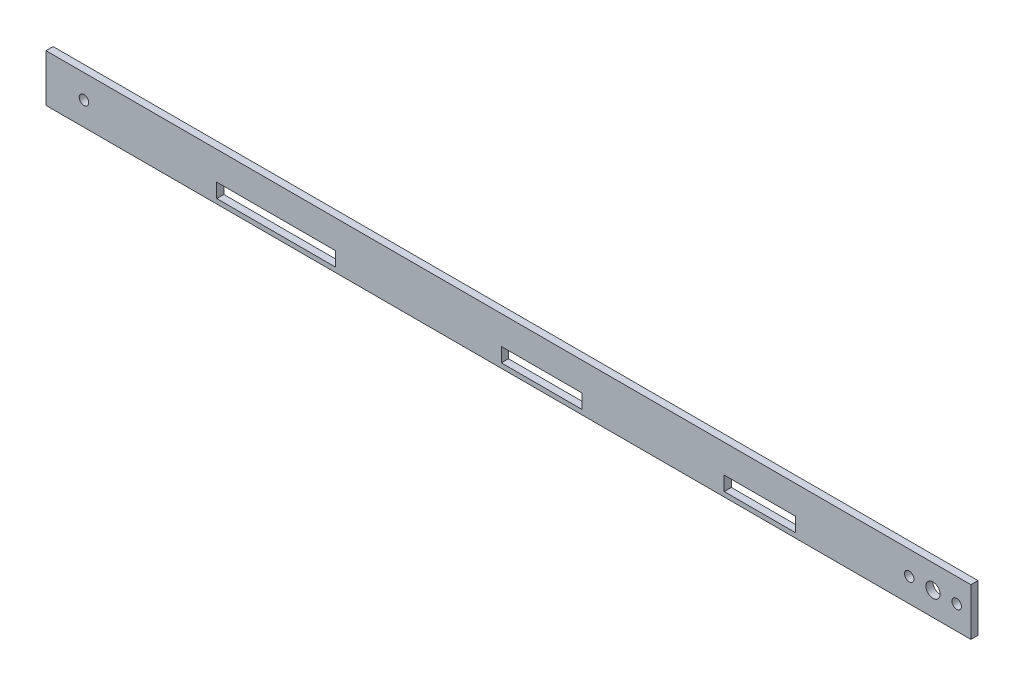
ISO-10303-21;
HEADER;
FILE_DESCRIPTION(('STEP AP214'),'2;1');
FILE_NAME('part.step','',(''),(''),'','','');
FILE_SCHEMA(('AUTOMOTIVE_DESIGN { 1 0 10303 214 1 1 1 1 }'));
ENDSEC;
DATA;
#1=APPLICATION_CONTEXT('core data for automotive mechanical design processes');
#2=APPLICATION_PROTOCOL_DEFINITION('international standard','automotive_design',2000,#1);
#3=PRODUCT_CONTEXT('',#1,'mechanical');
#4=PRODUCT('Part','Part','',(#3));
#5=PRODUCT_RELATED_PRODUCT_CATEGORY('part','',(#4));
#6=PRODUCT_DEFINITION_FORMATION('','',#4);
#7=PRODUCT_DEFINITION_CONTEXT('part definition',#1,'design');
#8=PRODUCT_DEFINITION('design','',#6,#7);
#9=PRODUCT_DEFINITION_SHAPE('','',#8);
#10=(LENGTH_UNIT() NAMED_UNIT(*) SI_UNIT(.MILLI.,.METRE.));
#11=(NAMED_UNIT(*) PLANE_ANGLE_UNIT() SI_UNIT($,.RADIAN.));
#12=(NAMED_UNIT(*) SI_UNIT($,.STERADIAN.) SOLID_ANGLE_UNIT());
#13=UNCERTAINTY_MEASURE_WITH_UNIT(LENGTH_MEASURE(1.E-05),#10,'distance_accuracy_value','');
#14=(GEOMETRIC_REPRESENTATION_CONTEXT(3) GLOBAL_UNCERTAINTY_ASSIGNED_CONTEXT((#13)) GLOBAL_UNIT_ASSIGNED_CONTEXT((#10,
#11,#12)) REPRESENTATION_CONTEXT('',''));
#15=CARTESIAN_POINT('',(0.,0.,0.));
#16=DIRECTION('',(0.,0.,1.));
#17=DIRECTION('',(1.,0.,0.));
#18=AXIS2_PLACEMENT_3D('',#15,#16,#17);
#19=CARTESIAN_POINT('',(0.,0.,1.5));
#20=DIRECTION('',(0.,0.,1.));
#21=DIRECTION('',(1.,0.,0.));
#22=AXIS2_PLACEMENT_3D('',#19,#20,#21);
#23=PLANE('',#22);
#24=DIRECTION('',(0.,1.,0.));
#25=VECTOR('',#24,1.);
#26=CARTESIAN_POINT('',(-42.,0.,1.5));
#27=LINE('',#26,#25);
#28=CARTESIAN_POINT('',(-42.,-9.00000000000011,1.5));
#29=VERTEX_POINT('',#28);
#30=CARTESIAN_POINT('',(-42.,-6.00000000000011,1.5));
#31=VERTEX_POINT('',#30);
#32=EDGE_CURVE('E249',#29,#31,#27,.T.);
#33=ORIENTED_EDGE('',*,*,#32,.F.);
#34=DIRECTION('',(1.,0.,0.));
#35=VECTOR('',#34,1.);
#36=CARTESIAN_POINT('',(0.,-9.00000000000011,1.5));
#37=LINE('',#36,#35);
#38=CARTESIAN_POINT('',(-57.,-9.00000000000011,1.5));
#39=VERTEX_POINT('',#38);
#40=EDGE_CURVE('E241',#39,#29,#37,.T.);
#41=ORIENTED_EDGE('',*,*,#40,.F.);
#42=DIRECTION('',(0.,1.,0.));
#43=VECTOR('',#42,1.);
#44=CARTESIAN_POINT('',(-57.,0.,1.5));
#45=LINE('',#44,#43);
#46=CARTESIAN_POINT('',(-57.,-6.00000000000011,1.5));
#47=VERTEX_POINT('',#46);
#48=EDGE_CURVE('E243',#39,#47,#45,.T.);
#49=ORIENTED_EDGE('',*,*,#48,.T.);
#50=DIRECTION('',(1.,0.,0.));
#51=VECTOR('',#50,1.);
#52=CARTESIAN_POINT('',(0.,-6.00000000000011,1.5));
#53=LINE('',#52,#51);
#54=EDGE_CURVE('E246',#47,#31,#53,.T.);
#55=ORIENTED_EDGE('',*,*,#54,.T.);
#56=EDGE_LOOP('',(#33,#41,#49,#55));
#57=FACE_BOUND('',#56,.T.);
#58=DIRECTION('',(0.,1.,0.));
#59=VECTOR('',#58,1.);
#60=CARTESIAN_POINT('',(-139.,0.,1.5));
#61=LINE('',#60,#59);
#62=CARTESIAN_POINT('',(-139.,-9.00000000000011,1.5));
#63=VERTEX_POINT('',#62);
#64=CARTESIAN_POINT('',(-139.,-6.00000000000011,1.5));
#65=VERTEX_POINT('',#64);
#66=EDGE_CURVE('E239',#63,#65,#61,.T.);
#67=ORIENTED_EDGE('',*,*,#66,.F.);
#68=DIRECTION('',(1.,0.,0.));
#69=VECTOR('',#68,1.);
#70=CARTESIAN_POINT('',(0.,-9.00000000000011,1.5));
#71=LINE('',#70,#69);
#72=CARTESIAN_POINT('',(-164.,-9.00000000000011,1.5));
#73=VERTEX_POINT('',#72);
#74=EDGE_CURVE('E233',#73,#63,#71,.T.);
#75=ORIENTED_EDGE('',*,*,#74,.F.);
#76=DIRECTION('',(0.,-1.,0.));
#77=VECTOR('',#76,1.);
#78=CARTESIAN_POINT('',(-164.,0.,1.5));
#79=LINE('',#78,#77);
#80=CARTESIAN_POINT('',(-164.,-6.00000000000011,1.5));
#81=VERTEX_POINT('',#80);
#82=EDGE_CURVE('E157',#81,#73,#79,.T.);
#83=ORIENTED_EDGE('',*,*,#82,.F.);
#84=DIRECTION('',(1.,0.,0.));
#85=VECTOR('',#84,1.);
#86=CARTESIAN_POINT('',(0.,-6.00000000000011,1.5));
#87=LINE('',#86,#85);
#88=EDGE_CURVE('E236',#81,#65,#87,.T.);
#89=ORIENTED_EDGE('',*,*,#88,.T.);
#90=EDGE_LOOP('',(#67,#75,#83,#89));
#91=FACE_BOUND('',#90,.T.);
#92=CARTESIAN_POINT('',(-18.,-5.00000000000011,1.5));
#93=DIRECTION('',(0.,0.,1.));
#94=DIRECTION('',(1.,0.,0.));
#95=AXIS2_PLACEMENT_3D('',#92,#93,#94);
#96=CIRCLE('',#95,1.);
#97=CARTESIAN_POINT('',(-17.,-5.00000000000011,1.5));
#98=VERTEX_POINT('',#97);
#99=EDGE_CURVE('E259',#98,#98,#96,.F.);
#100=ORIENTED_EDGE('',*,*,#99,.T.);
#101=EDGE_LOOP('',(#100));
#102=FACE_BOUND('',#101,.T.);
#103=CARTESIAN_POINT('',(-8.,-5.00000000000011,1.5));
#104=DIRECTION('',(0.,0.,1.));
#105=DIRECTION('',(1.,0.,0.));
#106=AXIS2_PLACEMENT_3D('',#103,#104,#105);
#107=CIRCLE('',#106,0.999999999999998);
#108=CARTESIAN_POINT('',(-7.00000000000001,-5.00000000000011,1.5));
#109=VERTEX_POINT('',#108);
#110=EDGE_CURVE('E256',#109,#109,#107,.F.);
#111=ORIENTED_EDGE('',*,*,#110,.T.);
#112=EDGE_LOOP('',(#111));
#113=FACE_BOUND('',#112,.T.);
#114=CARTESIAN_POINT('',(-13.,-5.00000000000011,1.5));
#115=DIRECTION('',(0.,0.,1.));
#116=DIRECTION('',(1.,0.,0.));
#117=AXIS2_PLACEMENT_3D('',#114,#115,#116);
#118=CIRCLE('',#117,1.5);
#119=CARTESIAN_POINT('',(-11.5,-5.00000000000011,1.5));
#120=VERTEX_POINT('',#119);
#121=EDGE_CURVE('E252',#120,#120,#118,.F.);
#122=ORIENTED_EDGE('',*,*,#121,.T.);
#123=EDGE_LOOP('',(#122));
#124=FACE_BOUND('',#123,.T.);
#125=CARTESIAN_POINT('',(-192.,-5.00000000000011,1.5));
#126=DIRECTION('',(0.,0.,1.));
#127=DIRECTION('',(1.,0.,0.));
#128=AXIS2_PLACEMENT_3D('',#125,#126,#127);
#129=CIRCLE('',#128,0.999999999999998);
#130=CARTESIAN_POINT('',(-191.,-5.00000000000011,1.5));
#131=VERTEX_POINT('',#130);
#132=EDGE_CURVE('E263',#131,#131,#129,.F.);
#133=ORIENTED_EDGE('',*,*,#132,.T.);
#134=EDGE_LOOP('',(#133));
#135=FACE_BOUND('',#134,.T.);
#136=DIRECTION('',(0.,-1.,0.));
#137=VECTOR('',#136,1.);
#138=CARTESIAN_POINT('',(-200.,-1.10159736291652E-13,1.5));
#139=LINE('',#138,#137);
#140=CARTESIAN_POINT('',(-200.,-1.10159736291652E-13,1.5));
#141=VERTEX_POINT('',#140);
#142=CARTESIAN_POINT('',(-200.,-10.0000000000001,1.5));
#143=VERTEX_POINT('',#142);
#144=EDGE_CURVE('E267',#141,#143,#139,.T.);
#145=ORIENTED_EDGE('',*,*,#144,.T.);
#146=DIRECTION('',(1.,0.,0.));
#147=VECTOR('',#146,1.);
#148=CARTESIAN_POINT('',(-200.,-10.0000000000001,1.5));
#149=LINE('',#148,#147);
#150=CARTESIAN_POINT('',(-5.,-10.0000000000001,1.5));
#151=VERTEX_POINT('',#150);
#152=EDGE_CURVE('E270',#143,#151,#149,.T.);
#153=ORIENTED_EDGE('',*,*,#152,.T.);
#154=DIRECTION('',(0.,1.,0.));
#155=VECTOR('',#154,1.);
#156=CARTESIAN_POINT('',(-5.,-1.11022302462516E-13,1.5));
#157=LINE('',#156,#155);
#158=CARTESIAN_POINT('',(-5.,-1.11022302462516E-13,1.5));
#159=VERTEX_POINT('',#158);
#160=EDGE_CURVE('E273',#151,#159,#157,.T.);
#161=ORIENTED_EDGE('',*,*,#160,.T.);
#162=DIRECTION('',(-1.,0.,0.));
#163=VECTOR('',#162,1.);
#164=CARTESIAN_POINT('',(-200.,-1.10159736291652E-13,1.5));
#165=LINE('',#164,#163);
#166=EDGE_CURVE('E275',#159,#141,#165,.T.);
#167=ORIENTED_EDGE('',*,*,#166,.T.);
#168=EDGE_LOOP('',(#145,#153,#161,#167));
#169=FACE_BOUND('',#168,.T.);
#170=DIRECTION('',(0.,1.,0.));
#171=VECTOR('',#170,1.);
#172=CARTESIAN_POINT('',(-104.,0.,1.5));
#173=LINE('',#172,#171);
#174=CARTESIAN_POINT('',(-104.,-9.00000000000011,1.5));
#175=VERTEX_POINT('',#174);
#176=CARTESIAN_POINT('',(-104.,-6.00000000000011,1.5));
#177=VERTEX_POINT('',#176);
#178=EDGE_CURVE('E227',#175,#177,#173,.T.);
#179=ORIENTED_EDGE('',*,*,#178,.T.);
#180=DIRECTION('',(1.,0.,0.));
#181=VECTOR('',#180,1.);
#182=CARTESIAN_POINT('',(0.,-6.00000000000011,1.5));
#183=LINE('',#182,#181);
#184=CARTESIAN_POINT('',(-87.,-6.00000000000011,1.5));
#185=VERTEX_POINT('',#184);
#186=EDGE_CURVE('E230',#177,#185,#183,.T.);
#187=ORIENTED_EDGE('',*,*,#186,.T.);
#188=DIRECTION('',(0.,1.,0.));
#189=VECTOR('',#188,1.);
#190=CARTESIAN_POINT('',(-87.,0.,1.5));
#191=LINE('',#190,#189);
#192=CARTESIAN_POINT('',(-87.,-9.00000000000011,1.5));
#193=VERTEX_POINT('',#192);
#194=EDGE_CURVE('E216',#193,#185,#191,.T.);
#195=ORIENTED_EDGE('',*,*,#194,.F.);
#196=DIRECTION('',(-1.,0.,0.));
#197=VECTOR('',#196,1.);
#198=CARTESIAN_POINT('',(0.,-9.00000000000012,1.5));
#199=LINE('',#198,#197);
#200=EDGE_CURVE('E224',#193,#175,#199,.T.);
#201=ORIENTED_EDGE('',*,*,#200,.T.);
#202=EDGE_LOOP('',(#179,#187,#195,#201));
#203=FACE_BOUND('',#202,.T.);
#204=ADVANCED_FACE('F37',(#57,#91,#102,#113,#124,#135,#169,#203),#23,.T.);
#205=CARTESIAN_POINT('',(0.,0.,0.));
#206=DIRECTION('',(0.,0.,1.));
#207=DIRECTION('',(1.,0.,0.));
#208=AXIS2_PLACEMENT_3D('',#205,#206,#207);
#209=PLANE('',#208);
#210=DIRECTION('',(-1.,0.,0.));
#211=VECTOR('',#210,1.);
#212=CARTESIAN_POINT('',(0.,-9.00000000000011,0.));
#213=LINE('',#212,#211);
#214=CARTESIAN_POINT('',(-42.,-9.00000000000011,0.));
#215=VERTEX_POINT('',#214);
#216=CARTESIAN_POINT('',(-57.,-9.00000000000011,0.));
#217=VERTEX_POINT('',#216);
#218=EDGE_CURVE('E186',#215,#217,#213,.T.);
#219=ORIENTED_EDGE('',*,*,#218,.F.);
#220=DIRECTION('',(0.,-1.,0.));
#221=VECTOR('',#220,1.);
#222=CARTESIAN_POINT('',(-42.,0.,0.));
#223=LINE('',#222,#221);
#224=CARTESIAN_POINT('',(-42.,-6.00000000000011,0.));
#225=VERTEX_POINT('',#224);
#226=EDGE_CURVE('E184',#225,#215,#223,.T.);
#227=ORIENTED_EDGE('',*,*,#226,.F.);
#228=DIRECTION('',(-1.,0.,0.));
#229=VECTOR('',#228,1.);
#230=CARTESIAN_POINT('',(0.,-6.00000000000011,0.));
#231=LINE('',#230,#229);
#232=CARTESIAN_POINT('',(-57.,-6.00000000000011,0.));
#233=VERTEX_POINT('',#232);
#234=EDGE_CURVE('E191',#225,#233,#231,.T.);
#235=ORIENTED_EDGE('',*,*,#234,.T.);
#236=DIRECTION('',(0.,-1.,0.));
#237=VECTOR('',#236,1.);
#238=CARTESIAN_POINT('',(-57.,0.,0.));
#239=LINE('',#238,#237);
#240=EDGE_CURVE('E188',#233,#217,#239,.T.);
#241=ORIENTED_EDGE('',*,*,#240,.T.);
#242=EDGE_LOOP('',(#219,#227,#235,#241));
#243=FACE_BOUND('',#242,.T.);
#244=DIRECTION('',(-1.,0.,0.));
#245=VECTOR('',#244,1.);
#246=CARTESIAN_POINT('',(0.,-9.00000000000011,0.));
#247=LINE('',#246,#245);
#248=CARTESIAN_POINT('',(-139.,-9.00000000000011,0.));
#249=VERTEX_POINT('',#248);
#250=CARTESIAN_POINT('',(-164.,-9.00000000000011,0.));
#251=VERTEX_POINT('',#250);
#252=EDGE_CURVE('E164',#249,#251,#247,.T.);
#253=ORIENTED_EDGE('',*,*,#252,.F.);
#254=DIRECTION('',(0.,-1.,0.));
#255=VECTOR('',#254,1.);
#256=CARTESIAN_POINT('',(-139.,0.,0.));
#257=LINE('',#256,#255);
#258=CARTESIAN_POINT('',(-139.,-6.00000000000011,0.));
#259=VERTEX_POINT('',#258);
#260=EDGE_CURVE('E169',#259,#249,#257,.T.);
#261=ORIENTED_EDGE('',*,*,#260,.F.);
#262=DIRECTION('',(-1.,0.,0.));
#263=VECTOR('',#262,1.);
#264=CARTESIAN_POINT('',(0.,-6.00000000000011,0.));
#265=LINE('',#264,#263);
#266=CARTESIAN_POINT('',(-164.,-6.00000000000011,0.));
#267=VERTEX_POINT('',#266);
#268=EDGE_CURVE('E174',#259,#267,#265,.T.);
#269=ORIENTED_EDGE('',*,*,#268,.T.);
#270=DIRECTION('',(0.,1.,0.));
#271=VECTOR('',#270,1.);
#272=CARTESIAN_POINT('',(-164.,0.,0.));
#273=LINE('',#272,#271);
#274=EDGE_CURVE('E154',#251,#267,#273,.T.);
#275=ORIENTED_EDGE('',*,*,#274,.F.);
#276=EDGE_LOOP('',(#253,#261,#269,#275));
#277=FACE_BOUND('',#276,.T.);
#278=DIRECTION('',(0.,-1.,0.));
#279=VECTOR('',#278,1.);
#280=CARTESIAN_POINT('',(-200.,-1.10159736291652E-13,0.));
#281=LINE('',#280,#279);
#282=CARTESIAN_POINT('',(-200.,-1.10159736291652E-13,0.));
#283=VERTEX_POINT('',#282);
#284=CARTESIAN_POINT('',(-200.,-10.0000000000001,0.));
#285=VERTEX_POINT('',#284);
#286=EDGE_CURVE('E266',#283,#285,#281,.T.);
#287=ORIENTED_EDGE('',*,*,#286,.F.);
#288=DIRECTION('',(-1.,0.,0.));
#289=VECTOR('',#288,1.);
#290=CARTESIAN_POINT('',(-200.,-1.10159736291652E-13,0.));
#291=LINE('',#290,#289);
#292=CARTESIAN_POINT('',(-5.,-1.11022302462516E-13,0.));
#293=VERTEX_POINT('',#292);
#294=EDGE_CURVE('E271',#293,#283,#291,.T.);
#295=ORIENTED_EDGE('',*,*,#294,.F.);
#296=DIRECTION('',(0.,1.,0.));
#297=VECTOR('',#296,1.);
#298=CARTESIAN_POINT('',(-5.,-1.11022302462516E-13,0.));
#299=LINE('',#298,#297);
#300=CARTESIAN_POINT('',(-5.,-10.0000000000001,0.));
#301=VERTEX_POINT('',#300);
#302=EDGE_CURVE('E282',#301,#293,#299,.T.);
#303=ORIENTED_EDGE('',*,*,#302,.F.);
#304=DIRECTION('',(1.,0.,0.));
#305=VECTOR('',#304,1.);
#306=CARTESIAN_POINT('',(-200.,-10.0000000000001,0.));
#307=LINE('',#306,#305);
#308=EDGE_CURVE('E280',#285,#301,#307,.T.);
#309=ORIENTED_EDGE('',*,*,#308,.F.);
#310=EDGE_LOOP('',(#287,#295,#303,#309));
#311=FACE_BOUND('',#310,.T.);
#312=CARTESIAN_POINT('',(-192.,-5.00000000000011,0.));
#313=DIRECTION('',(0.,0.,1.));
#314=DIRECTION('',(1.,0.,0.));
#315=AXIS2_PLACEMENT_3D('',#312,#313,#314);
#316=CIRCLE('',#315,0.999999999999998);
#317=CARTESIAN_POINT('',(-191.,-5.00000000000011,0.));
#318=VERTEX_POINT('',#317);
#319=EDGE_CURVE('E262',#318,#318,#316,.F.);
#320=ORIENTED_EDGE('',*,*,#319,.F.);
#321=EDGE_LOOP('',(#320));
#322=FACE_BOUND('',#321,.T.);
#323=CARTESIAN_POINT('',(-13.,-5.00000000000011,0.));
#324=DIRECTION('',(0.,0.,1.));
#325=DIRECTION('',(1.,0.,0.));
#326=AXIS2_PLACEMENT_3D('',#323,#324,#325);
#327=CIRCLE('',#326,1.5);
#328=CARTESIAN_POINT('',(-11.5,-5.00000000000011,0.));
#329=VERTEX_POINT('',#328);
#330=EDGE_CURVE('E251',#329,#329,#327,.F.);
#331=ORIENTED_EDGE('',*,*,#330,.F.);
#332=EDGE_LOOP('',(#331));
#333=FACE_BOUND('',#332,.T.);
#334=CARTESIAN_POINT('',(-8.,-5.00000000000011,0.));
#335=DIRECTION('',(0.,0.,1.));
#336=DIRECTION('',(1.,0.,0.));
#337=AXIS2_PLACEMENT_3D('',#334,#335,#336);
#338=CIRCLE('',#337,0.999999999999998);
#339=CARTESIAN_POINT('',(-7.00000000000001,-5.00000000000011,0.));
#340=VERTEX_POINT('',#339);
#341=EDGE_CURVE('E255',#340,#340,#338,.F.);
#342=ORIENTED_EDGE('',*,*,#341,.F.);
#343=EDGE_LOOP('',(#342));
#344=FACE_BOUND('',#343,.T.);
#345=CARTESIAN_POINT('',(-18.,-5.00000000000011,0.));
#346=DIRECTION('',(0.,0.,1.));
#347=DIRECTION('',(1.,0.,0.));
#348=AXIS2_PLACEMENT_3D('',#345,#346,#347);
#349=CIRCLE('',#348,1.);
#350=CARTESIAN_POINT('',(-17.,-5.00000000000011,0.));
#351=VERTEX_POINT('',#350);
#352=EDGE_CURVE('E41',#351,#351,#349,.F.);
#353=ORIENTED_EDGE('',*,*,#352,.F.);
#354=EDGE_LOOP('',(#353));
#355=FACE_BOUND('',#354,.T.);
#356=DIRECTION('',(-1.,0.,0.));
#357=VECTOR('',#356,1.);
#358=CARTESIAN_POINT('',(0.,-6.00000000000011,0.));
#359=LINE('',#358,#357);
#360=CARTESIAN_POINT('',(-87.,-6.00000000000011,0.));
#361=VERTEX_POINT('',#360);
#362=CARTESIAN_POINT('',(-104.,-6.00000000000011,0.));
#363=VERTEX_POINT('',#362);
#364=EDGE_CURVE('E181',#361,#363,#359,.T.);
#365=ORIENTED_EDGE('',*,*,#364,.T.);
#366=DIRECTION('',(0.,-1.,0.));
#367=VECTOR('',#366,1.);
#368=CARTESIAN_POINT('',(-104.,0.,0.));
#369=LINE('',#368,#367);
#370=CARTESIAN_POINT('',(-104.,-9.00000000000011,0.));
#371=VERTEX_POINT('',#370);
#372=EDGE_CURVE('E210',#363,#371,#369,.T.);
#373=ORIENTED_EDGE('',*,*,#372,.T.);
#374=DIRECTION('',(1.,0.,0.));
#375=VECTOR('',#374,1.);
#376=CARTESIAN_POINT('',(0.,-9.00000000000012,0.));
#377=LINE('',#376,#375);
#378=CARTESIAN_POINT('',(-87.,-9.00000000000011,0.));
#379=VERTEX_POINT('',#378);
#380=EDGE_CURVE('E207',#371,#379,#377,.T.);
#381=ORIENTED_EDGE('',*,*,#380,.T.);
#382=DIRECTION('',(0.,-1.,0.));
#383=VECTOR('',#382,1.);
#384=CARTESIAN_POINT('',(-87.,0.,0.));
#385=LINE('',#384,#383);
#386=EDGE_CURVE('E204',#361,#379,#385,.T.);
#387=ORIENTED_EDGE('',*,*,#386,.F.);
#388=EDGE_LOOP('',(#365,#373,#381,#387));
#389=FACE_BOUND('',#388,.T.);
#390=ADVANCED_FACE('F171',(#243,#277,#311,#322,#333,#344,#355,#389),#209,.F.);
#391=CARTESIAN_POINT('',(-200.,-1.10159736291652E-13,1.5));
#392=DIRECTION('',(1.,0.,0.));
#393=DIRECTION('',(0.,0.,-1.));
#394=AXIS2_PLACEMENT_3D('',#391,#392,#393);
#395=PLANE('',#394);
#396=ORIENTED_EDGE('',*,*,#286,.T.);
#397=DIRECTION('',(0.,0.,-1.));
#398=VECTOR('',#397,1.);
#399=CARTESIAN_POINT('',(-200.,-10.0000000000001,1.5));
#400=LINE('',#399,#398);
#401=EDGE_CURVE('E11',#143,#285,#400,.T.);
#402=ORIENTED_EDGE('',*,*,#401,.F.);
#403=ORIENTED_EDGE('',*,*,#144,.F.);
#404=DIRECTION('',(0.,0.,-1.));
#405=VECTOR('',#404,1.);
#406=CARTESIAN_POINT('',(-200.,-1.10159736291652E-13,1.5));
#407=LINE('',#406,#405);
#408=EDGE_CURVE('E277',#141,#283,#407,.T.);
#409=ORIENTED_EDGE('',*,*,#408,.T.);
#410=EDGE_LOOP('',(#396,#402,#403,#409));
#411=FACE_BOUND('',#410,.T.);
#412=ADVANCED_FACE('F39',(#411),#395,.F.);
#413=CARTESIAN_POINT('',(-200.,-10.0000000000001,1.5));
#414=DIRECTION('',(0.,1.,0.));
#415=DIRECTION('',(0.,0.,1.));
#416=AXIS2_PLACEMENT_3D('',#413,#414,#415);
#417=PLANE('',#416);
#418=ORIENTED_EDGE('',*,*,#308,.T.);
#419=DIRECTION('',(0.,0.,-1.));
#420=VECTOR('',#419,1.);
#421=CARTESIAN_POINT('',(-5.,-10.0000000000001,1.5));
#422=LINE('',#421,#420);
#423=EDGE_CURVE('E46',#151,#301,#422,.T.);
#424=ORIENTED_EDGE('',*,*,#423,.F.);
#425=ORIENTED_EDGE('',*,*,#152,.F.);
#426=ORIENTED_EDGE('',*,*,#401,.T.);
#427=EDGE_LOOP('',(#418,#424,#425,#426));
#428=FACE_BOUND('',#427,.T.);
#429=ADVANCED_FACE('F350',(#428),#417,.F.);
#430=CARTESIAN_POINT('',(-5.,-1.11022302462516E-13,1.5));
#431=DIRECTION('',(-1.,0.,0.));
#432=DIRECTION('',(0.,0.,1.));
#433=AXIS2_PLACEMENT_3D('',#430,#431,#432);
#434=PLANE('',#433);
#435=ORIENTED_EDGE('',*,*,#302,.T.);
#436=DIRECTION('',(0.,0.,-1.));
#437=VECTOR('',#436,1.);
#438=CARTESIAN_POINT('',(-5.,-1.11022302462516E-13,1.5));
#439=LINE('',#438,#437);
#440=EDGE_CURVE('E287',#159,#293,#439,.T.);
#441=ORIENTED_EDGE('',*,*,#440,.F.);
#442=ORIENTED_EDGE('',*,*,#160,.F.);
#443=ORIENTED_EDGE('',*,*,#423,.T.);
#444=EDGE_LOOP('',(#435,#441,#442,#443));
#445=FACE_BOUND('',#444,.T.);
#446=ADVANCED_FACE('F347',(#445),#434,.F.);
#447=CARTESIAN_POINT('',(-200.,-1.10159736291652E-13,1.5));
#448=DIRECTION('',(0.,-1.,0.));
#449=DIRECTION('',(1.,0.,0.));
#450=AXIS2_PLACEMENT_3D('',#447,#448,#449);
#451=PLANE('',#450);
#452=ORIENTED_EDGE('',*,*,#294,.T.);
#453=ORIENTED_EDGE('',*,*,#408,.F.);
#454=ORIENTED_EDGE('',*,*,#166,.F.);
#455=ORIENTED_EDGE('',*,*,#440,.T.);
#456=EDGE_LOOP('',(#452,#453,#454,#455));
#457=FACE_BOUND('',#456,.T.);
#458=ADVANCED_FACE('F344',(#457),#451,.F.);
#459=CARTESIAN_POINT('',(-192.,-5.00000000000011,13.5));
#460=DIRECTION('',(0.,0.,-1.));
#461=DIRECTION('',(-1.,0.,0.));
#462=AXIS2_PLACEMENT_3D('',#459,#460,#461);
#463=CYLINDRICAL_SURFACE('',#462,0.999999999999998);
#464=ORIENTED_EDGE('',*,*,#132,.F.);
#465=EDGE_LOOP('',(#464));
#466=FACE_BOUND('',#465,.T.);
#467=ORIENTED_EDGE('',*,*,#319,.T.);
#468=EDGE_LOOP('',(#467));
#469=FACE_BOUND('',#468,.T.);
#470=ADVANCED_FACE('F341',(#466,#469),#463,.F.);
#471=CARTESIAN_POINT('',(-13.,-5.00000000000011,33.5));
#472=DIRECTION('',(0.,0.,-1.));
#473=DIRECTION('',(-1.,0.,0.));
#474=AXIS2_PLACEMENT_3D('',#471,#472,#473);
#475=CYLINDRICAL_SURFACE('',#474,1.5);
#476=ORIENTED_EDGE('',*,*,#121,.F.);
#477=EDGE_LOOP('',(#476));
#478=FACE_BOUND('',#477,.T.);
#479=ORIENTED_EDGE('',*,*,#330,.T.);
#480=EDGE_LOOP('',(#479));
#481=FACE_BOUND('',#480,.T.);
#482=ADVANCED_FACE('F374',(#478,#481),#475,.F.);
#483=CARTESIAN_POINT('',(-8.,-5.00000000000011,33.5));
#484=DIRECTION('',(0.,0.,-1.));
#485=DIRECTION('',(-1.,0.,0.));
#486=AXIS2_PLACEMENT_3D('',#483,#484,#485);
#487=CYLINDRICAL_SURFACE('',#486,0.999999999999998);
#488=ORIENTED_EDGE('',*,*,#110,.F.);
#489=EDGE_LOOP('',(#488));
#490=FACE_BOUND('',#489,.T.);
#491=ORIENTED_EDGE('',*,*,#341,.T.);
#492=EDGE_LOOP('',(#491));
#493=FACE_BOUND('',#492,.T.);
#494=ADVANCED_FACE('F298',(#490,#493),#487,.F.);
#495=CARTESIAN_POINT('',(-18.,-5.00000000000011,33.5));
#496=DIRECTION('',(0.,0.,-1.));
#497=DIRECTION('',(-1.,0.,0.));
#498=AXIS2_PLACEMENT_3D('',#495,#496,#497);
#499=CYLINDRICAL_SURFACE('',#498,1.);
#500=ORIENTED_EDGE('',*,*,#99,.F.);
#501=EDGE_LOOP('',(#500));
#502=FACE_BOUND('',#501,.T.);
#503=ORIENTED_EDGE('',*,*,#352,.T.);
#504=EDGE_LOOP('',(#503));
#505=FACE_BOUND('',#504,.T.);
#506=ADVANCED_FACE('F381',(#502,#505),#499,.F.);
#507=CARTESIAN_POINT('',(0.,-6.00000000000011,10.));
#508=DIRECTION('',(0.,-1.,0.));
#509=DIRECTION('',(0.,0.,-1.));
#510=AXIS2_PLACEMENT_3D('',#507,#508,#509);
#511=PLANE('',#510);
#512=DIRECTION('',(0.,0.,-1.));
#513=VECTOR('',#512,1.);
#514=CARTESIAN_POINT('',(-104.,-6.00000000000011,10.));
#515=LINE('',#514,#513);
#516=EDGE_CURVE('E214',#177,#363,#515,.T.);
#517=ORIENTED_EDGE('',*,*,#516,.T.);
#518=ORIENTED_EDGE('',*,*,#364,.F.);
#519=DIRECTION('',(0.,0.,-1.));
#520=VECTOR('',#519,1.);
#521=CARTESIAN_POINT('',(-87.,-6.00000000000011,10.));
#522=LINE('',#521,#520);
#523=EDGE_CURVE('E213',#185,#361,#522,.T.);
#524=ORIENTED_EDGE('',*,*,#523,.F.);
#525=ORIENTED_EDGE('',*,*,#186,.F.);
#526=EDGE_LOOP('',(#517,#518,#524,#525));
#527=FACE_BOUND('',#526,.T.);
#528=ADVANCED_FACE('F311',(#527),#511,.T.);
#529=CARTESIAN_POINT('',(-104.,0.,10.));
#530=DIRECTION('',(1.,0.,0.));
#531=DIRECTION('',(0.,0.,-1.));
#532=AXIS2_PLACEMENT_3D('',#529,#530,#531);
#533=PLANE('',#532);
#534=DIRECTION('',(0.,0.,-1.));
#535=VECTOR('',#534,1.);
#536=CARTESIAN_POINT('',(-104.,-9.00000000000011,10.));
#537=LINE('',#536,#535);
#538=EDGE_CURVE('E217',#175,#371,#537,.T.);
#539=ORIENTED_EDGE('',*,*,#538,.T.);
#540=ORIENTED_EDGE('',*,*,#372,.F.);
#541=ORIENTED_EDGE('',*,*,#516,.F.);
#542=ORIENTED_EDGE('',*,*,#178,.F.);
#543=EDGE_LOOP('',(#539,#540,#541,#542));
#544=FACE_BOUND('',#543,.T.);
#545=ADVANCED_FACE('F319',(#544),#533,.T.);
#546=CARTESIAN_POINT('',(0.,-9.00000000000012,10.));
#547=DIRECTION('',(0.,1.,0.));
#548=DIRECTION('',(-1.,0.,0.));
#549=AXIS2_PLACEMENT_3D('',#546,#547,#548);
#550=PLANE('',#549);
#551=DIRECTION('',(0.,0.,-1.));
#552=VECTOR('',#551,1.);
#553=CARTESIAN_POINT('',(-87.,-9.00000000000011,10.));
#554=LINE('',#553,#552);
#555=EDGE_CURVE('E219',#193,#379,#554,.T.);
#556=ORIENTED_EDGE('',*,*,#555,.T.);
#557=ORIENTED_EDGE('',*,*,#380,.F.);
#558=ORIENTED_EDGE('',*,*,#538,.F.);
#559=ORIENTED_EDGE('',*,*,#200,.F.);
#560=EDGE_LOOP('',(#556,#557,#558,#559));
#561=FACE_BOUND('',#560,.T.);
#562=ADVANCED_FACE('F323',(#561),#550,.T.);
#563=CARTESIAN_POINT('',(-87.,0.,10.));
#564=DIRECTION('',(1.,0.,0.));
#565=DIRECTION('',(0.,0.,-1.));
#566=AXIS2_PLACEMENT_3D('',#563,#564,#565);
#567=PLANE('',#566);
#568=ORIENTED_EDGE('',*,*,#194,.T.);
#569=ORIENTED_EDGE('',*,*,#523,.T.);
#570=ORIENTED_EDGE('',*,*,#386,.T.);
#571=ORIENTED_EDGE('',*,*,#555,.F.);
#572=EDGE_LOOP('',(#568,#569,#570,#571));
#573=FACE_BOUND('',#572,.T.);
#574=ADVANCED_FACE('F314',(#573),#567,.F.);
#575=CARTESIAN_POINT('',(-139.,0.,10.));
#576=DIRECTION('',(1.,0.,0.));
#577=DIRECTION('',(0.,0.,-1.));
#578=AXIS2_PLACEMENT_3D('',#575,#576,#577);
#579=PLANE('',#578);
#580=ORIENTED_EDGE('',*,*,#66,.T.);
#581=DIRECTION('',(0.,0.,-1.));
#582=VECTOR('',#581,1.);
#583=CARTESIAN_POINT('',(-139.,-6.00000000000011,10.));
#584=LINE('',#583,#582);
#585=EDGE_CURVE('E179',#65,#259,#584,.T.);
#586=ORIENTED_EDGE('',*,*,#585,.T.);
#587=ORIENTED_EDGE('',*,*,#260,.T.);
#588=DIRECTION('',(0.,0.,-1.));
#589=VECTOR('',#588,1.);
#590=CARTESIAN_POINT('',(-139.,-9.00000000000011,10.));
#591=LINE('',#590,#589);
#592=EDGE_CURVE('E160',#63,#249,#591,.T.);
#593=ORIENTED_EDGE('',*,*,#592,.F.);
#594=EDGE_LOOP('',(#580,#586,#587,#593));
#595=FACE_BOUND('',#594,.T.);
#596=ADVANCED_FACE('F330',(#595),#579,.F.);
#597=CARTESIAN_POINT('',(0.,-6.00000000000011,10.));
#598=DIRECTION('',(0.,-1.,0.));
#599=DIRECTION('',(0.,0.,-1.));
#600=AXIS2_PLACEMENT_3D('',#597,#598,#599);
#601=PLANE('',#600);
#602=DIRECTION('',(0.,0.,-1.));
#603=VECTOR('',#602,1.);
#604=CARTESIAN_POINT('',(-164.,-6.00000000000011,10.));
#605=LINE('',#604,#603);
#606=EDGE_CURVE('E159',#81,#267,#605,.T.);
#607=ORIENTED_EDGE('',*,*,#606,.T.);
#608=ORIENTED_EDGE('',*,*,#268,.F.);
#609=ORIENTED_EDGE('',*,*,#585,.F.);
#610=ORIENTED_EDGE('',*,*,#88,.F.);
#611=EDGE_LOOP('',(#607,#608,#609,#610));
#612=FACE_BOUND('',#611,.T.);
#613=ADVANCED_FACE('F420',(#612),#601,.T.);
#614=CARTESIAN_POINT('',(-164.,0.,10.));
#615=DIRECTION('',(-1.,0.,0.));
#616=DIRECTION('',(0.,0.,1.));
#617=AXIS2_PLACEMENT_3D('',#614,#615,#616);
#618=PLANE('',#617);
#619=ORIENTED_EDGE('',*,*,#82,.T.);
#620=DIRECTION('',(0.,0.,-1.));
#621=VECTOR('',#620,1.);
#622=CARTESIAN_POINT('',(-164.,-9.00000000000011,10.));
#623=LINE('',#622,#621);
#624=EDGE_CURVE('E62',#73,#251,#623,.T.);
#625=ORIENTED_EDGE('',*,*,#624,.T.);
#626=ORIENTED_EDGE('',*,*,#274,.T.);
#627=ORIENTED_EDGE('',*,*,#606,.F.);
#628=EDGE_LOOP('',(#619,#625,#626,#627));
#629=FACE_BOUND('',#628,.T.);
#630=ADVANCED_FACE('F151',(#629),#618,.F.);
#631=CARTESIAN_POINT('',(0.,-9.00000000000011,10.));
#632=DIRECTION('',(0.,-1.,0.));
#633=DIRECTION('',(0.,0.,-1.));
#634=AXIS2_PLACEMENT_3D('',#631,#632,#633);
#635=PLANE('',#634);
#636=ORIENTED_EDGE('',*,*,#74,.T.);
#637=ORIENTED_EDGE('',*,*,#592,.T.);
#638=ORIENTED_EDGE('',*,*,#252,.T.);
#639=ORIENTED_EDGE('',*,*,#624,.F.);
#640=EDGE_LOOP('',(#636,#637,#638,#639));
#641=FACE_BOUND('',#640,.T.);
#642=ADVANCED_FACE('F165',(#641),#635,.F.);
#643=CARTESIAN_POINT('',(-42.,0.,10.));
#644=DIRECTION('',(1.,0.,0.));
#645=DIRECTION('',(0.,0.,-1.));
#646=AXIS2_PLACEMENT_3D('',#643,#644,#645);
#647=PLANE('',#646);
#648=ORIENTED_EDGE('',*,*,#32,.T.);
#649=DIRECTION('',(0.,0.,-1.));
#650=VECTOR('',#649,1.);
#651=CARTESIAN_POINT('',(-42.,-6.00000000000011,10.));
#652=LINE('',#651,#650);
#653=EDGE_CURVE('E195',#31,#225,#652,.T.);
#654=ORIENTED_EDGE('',*,*,#653,.T.);
#655=ORIENTED_EDGE('',*,*,#226,.T.);
#656=DIRECTION('',(0.,0.,-1.));
#657=VECTOR('',#656,1.);
#658=CARTESIAN_POINT('',(-42.,-9.00000000000011,10.));
#659=LINE('',#658,#657);
#660=EDGE_CURVE('E194',#29,#215,#659,.T.);
#661=ORIENTED_EDGE('',*,*,#660,.F.);
#662=EDGE_LOOP('',(#648,#654,#655,#661));
#663=FACE_BOUND('',#662,.T.);
#664=ADVANCED_FACE('F450',(#663),#647,.F.);
#665=CARTESIAN_POINT('',(0.,-6.00000000000011,10.));
#666=DIRECTION('',(0.,-1.,0.));
#667=DIRECTION('',(0.,0.,-1.));
#668=AXIS2_PLACEMENT_3D('',#665,#666,#667);
#669=PLANE('',#668);
#670=DIRECTION('',(0.,0.,-1.));
#671=VECTOR('',#670,1.);
#672=CARTESIAN_POINT('',(-57.,-6.00000000000011,10.));
#673=LINE('',#672,#671);
#674=EDGE_CURVE('E197',#47,#233,#673,.T.);
#675=ORIENTED_EDGE('',*,*,#674,.T.);
#676=ORIENTED_EDGE('',*,*,#234,.F.);
#677=ORIENTED_EDGE('',*,*,#653,.F.);
#678=ORIENTED_EDGE('',*,*,#54,.F.);
#679=EDGE_LOOP('',(#675,#676,#677,#678));
#680=FACE_BOUND('',#679,.T.);
#681=ADVANCED_FACE('F459',(#680),#669,.T.);
#682=CARTESIAN_POINT('',(-57.,0.,10.));
#683=DIRECTION('',(1.,0.,0.));
#684=DIRECTION('',(0.,0.,-1.));
#685=AXIS2_PLACEMENT_3D('',#682,#683,#684);
#686=PLANE('',#685);
#687=DIRECTION('',(0.,0.,-1.));
#688=VECTOR('',#687,1.);
#689=CARTESIAN_POINT('',(-57.,-9.00000000000011,10.));
#690=LINE('',#689,#688);
#691=EDGE_CURVE('E54',#39,#217,#690,.T.);
#692=ORIENTED_EDGE('',*,*,#691,.T.);
#693=ORIENTED_EDGE('',*,*,#240,.F.);
#694=ORIENTED_EDGE('',*,*,#674,.F.);
#695=ORIENTED_EDGE('',*,*,#48,.F.);
#696=EDGE_LOOP('',(#692,#693,#694,#695));
#697=FACE_BOUND('',#696,.T.);
#698=ADVANCED_FACE('F469',(#697),#686,.T.);
#699=CARTESIAN_POINT('',(0.,-9.00000000000011,10.));
#700=DIRECTION('',(0.,-1.,0.));
#701=DIRECTION('',(0.,0.,-1.));
#702=AXIS2_PLACEMENT_3D('',#699,#700,#701);
#703=PLANE('',#702);
#704=ORIENTED_EDGE('',*,*,#40,.T.);
#705=ORIENTED_EDGE('',*,*,#660,.T.);
#706=ORIENTED_EDGE('',*,*,#218,.T.);
#707=ORIENTED_EDGE('',*,*,#691,.F.);
#708=EDGE_LOOP('',(#704,#705,#706,#707));
#709=FACE_BOUND('',#708,.T.);
#710=ADVANCED_FACE('F479',(#709),#703,.F.);
#711=CLOSED_SHELL('',(#204,#390,#412,#429,#446,#458,#470,#482,#494,#506,#528,#545,#562,#574,
#596,#613,#630,#642,#664,#681,#698,#710));
#712=MANIFOLD_SOLID_BREP('B2',#711);
#713=ADVANCED_BREP_SHAPE_REPRESENTATION('',(#18,#712),#14);
#714=SHAPE_DEFINITION_REPRESENTATION(#9,#713);
ENDSEC;
END-ISO-10303-21;
